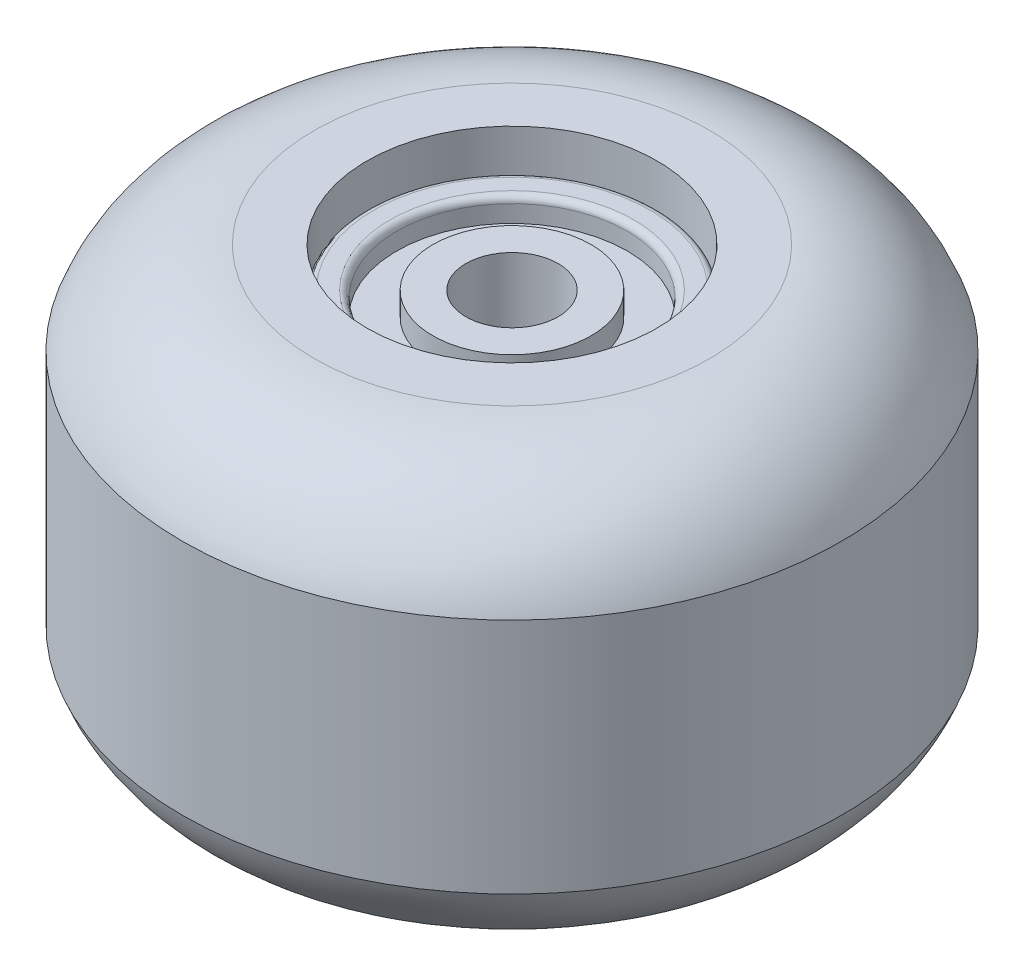
ISO-10303-21;
HEADER;
FILE_DESCRIPTION(('STEP AP214'),'2;1');
FILE_NAME('part.step','',(''),(''),'','','');
FILE_SCHEMA(('AUTOMOTIVE_DESIGN { 1 0 10303 214 1 1 1 1 }'));
ENDSEC;
DATA;
#1=APPLICATION_CONTEXT('core data for automotive mechanical design processes');
#2=APPLICATION_PROTOCOL_DEFINITION('international standard','automotive_design',2000,#1);
#3=PRODUCT_CONTEXT('',#1,'mechanical');
#4=PRODUCT('Part','Part','',(#3));
#5=PRODUCT_RELATED_PRODUCT_CATEGORY('part','',(#4));
#6=PRODUCT_DEFINITION_FORMATION('','',#4);
#7=PRODUCT_DEFINITION_CONTEXT('part definition',#1,'design');
#8=PRODUCT_DEFINITION('design','',#6,#7);
#9=PRODUCT_DEFINITION_SHAPE('','',#8);
#10=(LENGTH_UNIT() NAMED_UNIT(*) SI_UNIT(.MILLI.,.METRE.));
#11=(NAMED_UNIT(*) PLANE_ANGLE_UNIT() SI_UNIT($,.RADIAN.));
#12=(NAMED_UNIT(*) SI_UNIT($,.STERADIAN.) SOLID_ANGLE_UNIT());
#13=UNCERTAINTY_MEASURE_WITH_UNIT(LENGTH_MEASURE(1.E-05),#10,'distance_accuracy_value','');
#14=(GEOMETRIC_REPRESENTATION_CONTEXT(3) GLOBAL_UNCERTAINTY_ASSIGNED_CONTEXT((#13)) GLOBAL_UNIT_ASSIGNED_CONTEXT((#10,
#11,#12)) REPRESENTATION_CONTEXT('',''));
#15=CARTESIAN_POINT('',(0.,0.,0.));
#16=DIRECTION('',(0.,0.,1.));
#17=DIRECTION('',(1.,0.,0.));
#18=AXIS2_PLACEMENT_3D('',#15,#16,#17);
#19=CARTESIAN_POINT('',(0.,6.,0.));
#20=DIRECTION('',(0.,1.,0.));
#21=DIRECTION('',(0.297911004987922,0.,0.954593648159827));
#22=AXIS2_PLACEMENT_3D('',#19,#20,#21);
#23=PLANE('',#22);
#24=CARTESIAN_POINT('',(0.,6.,0.));
#25=DIRECTION('',(0.,1.,0.));
#26=DIRECTION('',(0.297911004987922,0.,0.954593648159827));
#27=AXIS2_PLACEMENT_3D('',#24,#25,#26);
#28=CIRCLE('',#27,3.5);
#29=CARTESIAN_POINT('',(1.04268851745776,6.,3.34107776855938));
#30=VERTEX_POINT('',#29);
#31=EDGE_CURVE('P0_E46',#30,#30,#28,.T.);
#32=ORIENTED_EDGE('',*,*,#31,.T.);
#33=EDGE_LOOP('',(#32));
#34=FACE_BOUND('',#33,.T.);
#35=CARTESIAN_POINT('',(0.,6.,0.));
#36=DIRECTION('',(0.,1.,0.));
#37=DIRECTION('',(0.297911004987922,0.,0.954593648159827));
#38=AXIS2_PLACEMENT_3D('',#35,#36,#37);
#39=CIRCLE('',#38,6.);
#40=CARTESIAN_POINT('',(1.78746602992756,6.,5.72756188895895));
#41=VERTEX_POINT('',#40);
#42=EDGE_CURVE('P0_E65',#41,#41,#39,.T.);
#43=ORIENTED_EDGE('',*,*,#42,.F.);
#44=EDGE_LOOP('',(#43));
#45=FACE_BOUND('',#44,.T.);
#46=ADVANCED_FACE('P0_F14',(#34,#45),#23,.F.);
#47=CARTESIAN_POINT('',(0.,13.,0.));
#48=DIRECTION('',(0.,1.,0.));
#49=DIRECTION('',(0.297911004987922,0.,0.954593648159827));
#50=AXIS2_PLACEMENT_3D('',#47,#48,#49);
#51=PLANE('',#50);
#52=CARTESIAN_POINT('',(0.,13.,0.));
#53=DIRECTION('',(0.,1.,0.));
#54=DIRECTION('',(0.297911004987922,0.,0.954593648159827));
#55=AXIS2_PLACEMENT_3D('',#52,#53,#54);
#56=CIRCLE('',#55,3.5);
#57=CARTESIAN_POINT('',(1.04268851745776,13.,3.34107776855938));
#58=VERTEX_POINT('',#57);
#59=EDGE_CURVE('P0_E47',#58,#58,#56,.T.);
#60=ORIENTED_EDGE('',*,*,#59,.F.);
#61=EDGE_LOOP('',(#60));
#62=FACE_BOUND('',#61,.T.);
#63=CARTESIAN_POINT('',(0.,13.,0.));
#64=DIRECTION('',(0.,1.,0.));
#65=DIRECTION('',(0.297911004987922,0.,0.954593648159827));
#66=AXIS2_PLACEMENT_3D('',#63,#64,#65);
#67=CIRCLE('',#66,6.);
#68=CARTESIAN_POINT('',(1.78746602992756,13.,5.72756188895895));
#69=VERTEX_POINT('',#68);
#70=EDGE_CURVE('P0_E56',#69,#69,#67,.T.);
#71=ORIENTED_EDGE('',*,*,#70,.T.);
#72=EDGE_LOOP('',(#71));
#73=FACE_BOUND('',#72,.T.);
#74=ADVANCED_FACE('P0_F82',(#62,#73),#51,.T.);
#75=CARTESIAN_POINT('',(0.,13.,0.));
#76=DIRECTION('',(0.,-1.,0.));
#77=DIRECTION('',(-0.297911004987922,0.,-0.954593648159827));
#78=AXIS2_PLACEMENT_3D('',#75,#76,#77);
#79=CYLINDRICAL_SURFACE('',#78,11.);
#80=CARTESIAN_POINT('',(0.,12.5,0.));
#81=DIRECTION('',(0.,1.,0.));
#82=DIRECTION('',(0.297911004987922,0.,0.954593648159827));
#83=AXIS2_PLACEMENT_3D('',#80,#81,#82);
#84=CIRCLE('',#83,11.);
#85=CARTESIAN_POINT('',(3.27702105486717,12.5,10.5005301297581));
#86=VERTEX_POINT('',#85);
#87=EDGE_CURVE('P0_E34',#86,#86,#84,.F.);
#88=ORIENTED_EDGE('',*,*,#87,.T.);
#89=EDGE_LOOP('',(#88));
#90=FACE_BOUND('',#89,.T.);
#91=CARTESIAN_POINT('',(0.,6.5,0.));
#92=DIRECTION('',(0.,1.,0.));
#93=DIRECTION('',(0.297911004987922,0.,0.954593648159827));
#94=AXIS2_PLACEMENT_3D('',#91,#92,#93);
#95=CIRCLE('',#94,11.);
#96=CARTESIAN_POINT('',(3.27702105486717,6.5,10.5005301297581));
#97=VERTEX_POINT('',#96);
#98=EDGE_CURVE('P0_E37',#97,#97,#95,.T.);
#99=ORIENTED_EDGE('',*,*,#98,.T.);
#100=EDGE_LOOP('',(#99));
#101=FACE_BOUND('',#100,.T.);
#102=ADVANCED_FACE('P0_F90',(#90,#101),#79,.T.);
#103=CARTESIAN_POINT('',(0.,13.,0.));
#104=DIRECTION('',(0.,1.,0.));
#105=DIRECTION('',(0.297911004987922,0.,0.954593648159827));
#106=AXIS2_PLACEMENT_3D('',#103,#104,#105);
#107=CIRCLE('',#106,10.5);
#108=CARTESIAN_POINT('',(3.12806555237321,13.,10.0232333056782));
#109=VERTEX_POINT('',#108);
#110=EDGE_CURVE('P0_E40',#109,#109,#107,.T.);
#111=ORIENTED_EDGE('',*,*,#110,.T.);
#112=EDGE_LOOP('',(#111));
#113=FACE_BOUND('',#112,.T.);
#114=CARTESIAN_POINT('',(0.,13.,0.));
#115=DIRECTION('',(0.,1.,0.));
#116=DIRECTION('',(0.297911004987922,0.,0.954593648159827));
#117=AXIS2_PLACEMENT_3D('',#114,#115,#116);
#118=CIRCLE('',#117,9.25);
#119=CARTESIAN_POINT('',(2.75567679613831,13.,8.82999124547839));
#120=VERTEX_POINT('',#119);
#121=EDGE_CURVE('P0_E43',#120,#120,#118,.F.);
#122=ORIENTED_EDGE('',*,*,#121,.T.);
#123=EDGE_LOOP('',(#122));
#124=FACE_BOUND('',#123,.T.);
#125=ADVANCED_FACE('P0_F93',(#113,#124),#51,.T.);
#126=CARTESIAN_POINT('',(0.,6.,0.));
#127=DIRECTION('',(0.,1.,0.));
#128=DIRECTION('',(0.297911004987922,0.,0.954593648159827));
#129=AXIS2_PLACEMENT_3D('',#126,#127,#128);
#130=CIRCLE('',#129,10.5);
#131=CARTESIAN_POINT('',(3.12806555237321,6.,10.0232333056782));
#132=VERTEX_POINT('',#131);
#133=EDGE_CURVE('P0_E21',#132,#132,#130,.F.);
#134=ORIENTED_EDGE('',*,*,#133,.T.);
#135=EDGE_LOOP('',(#134));
#136=FACE_BOUND('',#135,.T.);
#137=CARTESIAN_POINT('',(0.,6.,0.));
#138=DIRECTION('',(0.,1.,0.));
#139=DIRECTION('',(0.297911004987922,0.,0.954593648159827));
#140=AXIS2_PLACEMENT_3D('',#137,#138,#139);
#141=CIRCLE('',#140,9.25);
#142=CARTESIAN_POINT('',(2.75567679613831,6.,8.82999124547839));
#143=VERTEX_POINT('',#142);
#144=EDGE_CURVE('P0_E25',#143,#143,#141,.T.);
#145=ORIENTED_EDGE('',*,*,#144,.T.);
#146=EDGE_LOOP('',(#145));
#147=FACE_BOUND('',#146,.T.);
#148=ADVANCED_FACE('P0_F85',(#136,#147),#23,.F.);
#149=CARTESIAN_POINT('',(0.,6.,0.));
#150=DIRECTION('',(0.,1.,0.));
#151=DIRECTION('',(0.297911004987922,0.,0.954593648159827));
#152=AXIS2_PLACEMENT_3D('',#149,#150,#151);
#153=CYLINDRICAL_SURFACE('',#152,3.5);
#154=ORIENTED_EDGE('',*,*,#31,.F.);
#155=EDGE_LOOP('',(#154));
#156=FACE_BOUND('',#155,.T.);
#157=ORIENTED_EDGE('',*,*,#59,.T.);
#158=EDGE_LOOP('',(#157));
#159=FACE_BOUND('',#158,.T.);
#160=ADVANCED_FACE('P0_F96',(#156,#159),#153,.F.);
#161=CARTESIAN_POINT('',(0.,11.2,0.));
#162=DIRECTION('',(0.,1.,0.));
#163=DIRECTION('',(0.297911004987922,0.,0.954593648159827));
#164=AXIS2_PLACEMENT_3D('',#161,#162,#163);
#165=CYLINDRICAL_SURFACE('',#164,8.75);
#166=CARTESIAN_POINT('',(0.,12.5,0.));
#167=DIRECTION('',(0.,1.,0.));
#168=DIRECTION('',(0.297911004987922,0.,0.954593648159827));
#169=AXIS2_PLACEMENT_3D('',#166,#167,#168);
#170=CIRCLE('',#169,8.75);
#171=CARTESIAN_POINT('',(2.60672129364435,12.5,8.35269442139847));
#172=VERTEX_POINT('',#171);
#173=EDGE_CURVE('P0_E29',#172,#172,#170,.T.);
#174=ORIENTED_EDGE('',*,*,#173,.T.);
#175=EDGE_LOOP('',(#174));
#176=FACE_BOUND('',#175,.T.);
#177=CARTESIAN_POINT('',(0.,11.2,0.));
#178=DIRECTION('',(0.,1.,0.));
#179=DIRECTION('',(0.297911004987922,0.,0.954593648159827));
#180=AXIS2_PLACEMENT_3D('',#177,#178,#179);
#181=CIRCLE('',#180,8.75);
#182=CARTESIAN_POINT('',(2.60672129364435,11.2,8.35269442139847));
#183=VERTEX_POINT('',#182);
#184=EDGE_CURVE('P0_E50',#183,#183,#181,.T.);
#185=ORIENTED_EDGE('',*,*,#184,.F.);
#186=EDGE_LOOP('',(#185));
#187=FACE_BOUND('',#186,.T.);
#188=ADVANCED_FACE('P0_F101',(#176,#187),#165,.F.);
#189=CARTESIAN_POINT('',(0.,11.2,0.));
#190=DIRECTION('',(0.,1.,0.));
#191=DIRECTION('',(0.297911004987922,0.,0.954593648159827));
#192=AXIS2_PLACEMENT_3D('',#189,#190,#191);
#193=PLANE('',#192);
#194=CARTESIAN_POINT('',(0.,11.2,0.));
#195=DIRECTION('',(0.,1.,0.));
#196=DIRECTION('',(0.297911004987922,0.,0.954593648159827));
#197=AXIS2_PLACEMENT_3D('',#194,#195,#196);
#198=CIRCLE('',#197,6.);
#199=CARTESIAN_POINT('',(1.78746602992756,11.2,5.72756188895895));
#200=VERTEX_POINT('',#199);
#201=EDGE_CURVE('P0_E55',#200,#200,#198,.T.);
#202=ORIENTED_EDGE('',*,*,#201,.F.);
#203=EDGE_LOOP('',(#202));
#204=FACE_BOUND('',#203,.T.);
#205=ORIENTED_EDGE('',*,*,#184,.T.);
#206=EDGE_LOOP('',(#205));
#207=FACE_BOUND('',#206,.T.);
#208=ADVANCED_FACE('P0_F141',(#204,#207),#193,.T.);
#209=CARTESIAN_POINT('',(0.,11.2,0.));
#210=DIRECTION('',(0.,1.,0.));
#211=DIRECTION('',(0.297911004987922,0.,0.954593648159827));
#212=AXIS2_PLACEMENT_3D('',#209,#210,#211);
#213=CYLINDRICAL_SURFACE('',#212,6.);
#214=ORIENTED_EDGE('',*,*,#201,.T.);
#215=EDGE_LOOP('',(#214));
#216=FACE_BOUND('',#215,.T.);
#217=ORIENTED_EDGE('',*,*,#70,.F.);
#218=EDGE_LOOP('',(#217));
#219=FACE_BOUND('',#218,.T.);
#220=ADVANCED_FACE('P0_F146',(#216,#219),#213,.T.);
#221=CARTESIAN_POINT('',(0.,7.8,0.));
#222=DIRECTION('',(0.,-1.,0.));
#223=DIRECTION('',(0.297911004987922,0.,0.954593648159827));
#224=AXIS2_PLACEMENT_3D('',#221,#222,#223);
#225=PLANE('',#224);
#226=CARTESIAN_POINT('',(0.,7.8,0.));
#227=DIRECTION('',(0.,1.,0.));
#228=DIRECTION('',(0.297911004987922,0.,0.954593648159827));
#229=AXIS2_PLACEMENT_3D('',#226,#227,#228);
#230=CIRCLE('',#229,8.75);
#231=CARTESIAN_POINT('',(2.60672129364435,7.8,8.35269442139847));
#232=VERTEX_POINT('',#231);
#233=EDGE_CURVE('P0_E59',#232,#232,#230,.T.);
#234=ORIENTED_EDGE('',*,*,#233,.F.);
#235=EDGE_LOOP('',(#234));
#236=FACE_BOUND('',#235,.T.);
#237=CARTESIAN_POINT('',(0.,7.8,0.));
#238=DIRECTION('',(0.,1.,0.));
#239=DIRECTION('',(0.297911004987922,0.,0.954593648159827));
#240=AXIS2_PLACEMENT_3D('',#237,#238,#239);
#241=CIRCLE('',#240,6.);
#242=CARTESIAN_POINT('',(1.78746602992756,7.8,5.72756188895895));
#243=VERTEX_POINT('',#242);
#244=EDGE_CURVE('P0_E64',#243,#243,#241,.T.);
#245=ORIENTED_EDGE('',*,*,#244,.T.);
#246=EDGE_LOOP('',(#245));
#247=FACE_BOUND('',#246,.T.);
#248=ADVANCED_FACE('P0_F71',(#236,#247),#225,.T.);
#249=CARTESIAN_POINT('',(0.,7.8,0.));
#250=DIRECTION('',(0.,-1.,0.));
#251=DIRECTION('',(-0.297911004987922,0.,-0.954593648159827));
#252=AXIS2_PLACEMENT_3D('',#249,#250,#251);
#253=CYLINDRICAL_SURFACE('',#252,8.75);
#254=CARTESIAN_POINT('',(0.,6.5,0.));
#255=DIRECTION('',(0.,1.,0.));
#256=DIRECTION('',(0.297911004987922,0.,0.954593648159827));
#257=AXIS2_PLACEMENT_3D('',#254,#255,#256);
#258=CIRCLE('',#257,8.75);
#259=CARTESIAN_POINT('',(2.60672129364435,6.5,8.35269442139847));
#260=VERTEX_POINT('',#259);
#261=EDGE_CURVE('P0_E10',#260,#260,#258,.F.);
#262=ORIENTED_EDGE('',*,*,#261,.T.);
#263=EDGE_LOOP('',(#262));
#264=FACE_BOUND('',#263,.T.);
#265=ORIENTED_EDGE('',*,*,#233,.T.);
#266=EDGE_LOOP('',(#265));
#267=FACE_BOUND('',#266,.T.);
#268=ADVANCED_FACE('P0_F77',(#264,#267),#253,.F.);
#269=CARTESIAN_POINT('',(0.,7.8,0.));
#270=DIRECTION('',(0.,-1.,0.));
#271=DIRECTION('',(-0.297911004987922,0.,-0.954593648159827));
#272=AXIS2_PLACEMENT_3D('',#269,#270,#271);
#273=CYLINDRICAL_SURFACE('',#272,6.);
#274=ORIENTED_EDGE('',*,*,#244,.F.);
#275=EDGE_LOOP('',(#274));
#276=FACE_BOUND('',#275,.T.);
#277=ORIENTED_EDGE('',*,*,#42,.T.);
#278=EDGE_LOOP('',(#277));
#279=FACE_BOUND('',#278,.T.);
#280=ADVANCED_FACE('P0_F73',(#276,#279),#273,.T.);
#281=CARTESIAN_POINT('',(0.,12.5,0.));
#282=DIRECTION('',(0.,1.,0.));
#283=DIRECTION('',(0.297911004987922,0.,0.954593648159827));
#284=AXIS2_PLACEMENT_3D('',#281,#282,#283);
#285=TOROIDAL_SURFACE('',#284,10.5,0.5);
#286=ORIENTED_EDGE('',*,*,#87,.F.);
#287=EDGE_LOOP('',(#286));
#288=FACE_BOUND('',#287,.T.);
#289=ORIENTED_EDGE('',*,*,#110,.F.);
#290=EDGE_LOOP('',(#289));
#291=FACE_BOUND('',#290,.T.);
#292=ADVANCED_FACE('P0_F76',(#288,#291),#285,.T.);
#293=CARTESIAN_POINT('',(0.,12.5,0.));
#294=DIRECTION('',(0.,1.,0.));
#295=DIRECTION('',(0.297911004987922,0.,0.954593648159827));
#296=AXIS2_PLACEMENT_3D('',#293,#294,#295);
#297=TOROIDAL_SURFACE('',#296,9.25,0.5);
#298=ORIENTED_EDGE('',*,*,#121,.F.);
#299=EDGE_LOOP('',(#298));
#300=FACE_BOUND('',#299,.T.);
#301=ORIENTED_EDGE('',*,*,#173,.F.);
#302=EDGE_LOOP('',(#301));
#303=FACE_BOUND('',#302,.T.);
#304=ADVANCED_FACE('P0_F114',(#300,#303),#297,.T.);
#305=CARTESIAN_POINT('',(0.,6.5,0.));
#306=DIRECTION('',(0.,1.,0.));
#307=DIRECTION('',(0.297911004987922,0.,0.954593648159827));
#308=AXIS2_PLACEMENT_3D('',#305,#306,#307);
#309=TOROIDAL_SURFACE('',#308,10.5,0.5);
#310=ORIENTED_EDGE('',*,*,#133,.F.);
#311=EDGE_LOOP('',(#310));
#312=FACE_BOUND('',#311,.T.);
#313=ORIENTED_EDGE('',*,*,#98,.F.);
#314=EDGE_LOOP('',(#313));
#315=FACE_BOUND('',#314,.T.);
#316=ADVANCED_FACE('P0_F109',(#312,#315),#309,.T.);
#317=CARTESIAN_POINT('',(0.,6.5,0.));
#318=DIRECTION('',(0.,1.,0.));
#319=DIRECTION('',(0.297911004987922,0.,0.954593648159827));
#320=AXIS2_PLACEMENT_3D('',#317,#318,#319);
#321=TOROIDAL_SURFACE('',#320,9.25,0.5);
#322=ORIENTED_EDGE('',*,*,#261,.F.);
#323=EDGE_LOOP('',(#322));
#324=FACE_BOUND('',#323,.T.);
#325=ORIENTED_EDGE('',*,*,#144,.F.);
#326=EDGE_LOOP('',(#325));
#327=FACE_BOUND('',#326,.T.);
#328=ADVANCED_FACE('P0_F16',(#324,#327),#321,.T.);
#329=CLOSED_SHELL('',(#46,#74,#102,#125,#148,#160,#188,#208,#220,#248,#268,#280,#292,#304,#316,#328));
#330=MANIFOLD_SOLID_BREP('P0_B1',#329);
#331=CARTESIAN_POINT('',(0.,-13.,0.));
#332=DIRECTION('',(0.,1.,0.));
#333=DIRECTION('',(0.016209118928033,0.,0.99986862360191));
#334=AXIS2_PLACEMENT_3D('',#331,#332,#333);
#335=PLANE('',#334);
#336=CARTESIAN_POINT('',(0.,-13.,0.));
#337=DIRECTION('',(0.,1.,0.));
#338=DIRECTION('',(0.016209118928033,0.,0.99986862360191));
#339=AXIS2_PLACEMENT_3D('',#336,#337,#338);
#340=CIRCLE('',#339,3.5);
#341=CARTESIAN_POINT('',(0.0567319162481223,-13.,3.49954018260668));
#342=VERTEX_POINT('',#341);
#343=EDGE_CURVE('P1_E46',#342,#342,#340,.T.);
#344=ORIENTED_EDGE('',*,*,#343,.T.);
#345=EDGE_LOOP('',(#344));
#346=FACE_BOUND('',#345,.T.);
#347=CARTESIAN_POINT('',(0.,-13.,0.));
#348=DIRECTION('',(0.,1.,0.));
#349=DIRECTION('',(0.016209118928033,0.,0.99986862360191));
#350=AXIS2_PLACEMENT_3D('',#347,#348,#349);
#351=CIRCLE('',#350,6.);
#352=CARTESIAN_POINT('',(0.0972547135682047,-13.,5.99921174161146));
#353=VERTEX_POINT('',#352);
#354=EDGE_CURVE('P1_E65',#353,#353,#351,.T.);
#355=ORIENTED_EDGE('',*,*,#354,.F.);
#356=EDGE_LOOP('',(#355));
#357=FACE_BOUND('',#356,.T.);
#358=ADVANCED_FACE('P1_F14',(#346,#357),#335,.F.);
#359=CARTESIAN_POINT('',(0.,-6.,0.));
#360=DIRECTION('',(0.,1.,0.));
#361=DIRECTION('',(0.016209118928033,0.,0.99986862360191));
#362=AXIS2_PLACEMENT_3D('',#359,#360,#361);
#363=PLANE('',#362);
#364=CARTESIAN_POINT('',(0.,-6.,0.));
#365=DIRECTION('',(0.,1.,0.));
#366=DIRECTION('',(0.016209118928033,0.,0.99986862360191));
#367=AXIS2_PLACEMENT_3D('',#364,#365,#366);
#368=CIRCLE('',#367,3.5);
#369=CARTESIAN_POINT('',(0.0567319162481223,-6.,3.49954018260668));
#370=VERTEX_POINT('',#369);
#371=EDGE_CURVE('P1_E47',#370,#370,#368,.T.);
#372=ORIENTED_EDGE('',*,*,#371,.F.);
#373=EDGE_LOOP('',(#372));
#374=FACE_BOUND('',#373,.T.);
#375=CARTESIAN_POINT('',(0.,-6.,0.));
#376=DIRECTION('',(0.,1.,0.));
#377=DIRECTION('',(0.016209118928033,0.,0.99986862360191));
#378=AXIS2_PLACEMENT_3D('',#375,#376,#377);
#379=CIRCLE('',#378,6.);
#380=CARTESIAN_POINT('',(0.0972547135682047,-6.,5.99921174161146));
#381=VERTEX_POINT('',#380);
#382=EDGE_CURVE('P1_E56',#381,#381,#379,.T.);
#383=ORIENTED_EDGE('',*,*,#382,.T.);
#384=EDGE_LOOP('',(#383));
#385=FACE_BOUND('',#384,.T.);
#386=ADVANCED_FACE('P1_F82',(#374,#385),#363,.T.);
#387=CARTESIAN_POINT('',(0.,-6.,0.));
#388=DIRECTION('',(0.,-1.,0.));
#389=DIRECTION('',(-0.016209118928033,0.,-0.99986862360191));
#390=AXIS2_PLACEMENT_3D('',#387,#388,#389);
#391=CYLINDRICAL_SURFACE('',#390,11.);
#392=CARTESIAN_POINT('',(0.,-6.5,0.));
#393=DIRECTION('',(0.,1.,0.));
#394=DIRECTION('',(0.016209118928033,0.,0.99986862360191));
#395=AXIS2_PLACEMENT_3D('',#392,#393,#394);
#396=CIRCLE('',#395,11.);
#397=CARTESIAN_POINT('',(0.178300308208369,-6.5,10.998554859621));
#398=VERTEX_POINT('',#397);
#399=EDGE_CURVE('P1_E34',#398,#398,#396,.F.);
#400=ORIENTED_EDGE('',*,*,#399,.T.);
#401=EDGE_LOOP('',(#400));
#402=FACE_BOUND('',#401,.T.);
#403=CARTESIAN_POINT('',(0.,-12.5,0.));
#404=DIRECTION('',(0.,1.,0.));
#405=DIRECTION('',(0.016209118928033,0.,0.99986862360191));
#406=AXIS2_PLACEMENT_3D('',#403,#404,#405);
#407=CIRCLE('',#406,11.);
#408=CARTESIAN_POINT('',(0.178300308208369,-12.5,10.998554859621));
#409=VERTEX_POINT('',#408);
#410=EDGE_CURVE('P1_E37',#409,#409,#407,.T.);
#411=ORIENTED_EDGE('',*,*,#410,.T.);
#412=EDGE_LOOP('',(#411));
#413=FACE_BOUND('',#412,.T.);
#414=ADVANCED_FACE('P1_F90',(#402,#413),#391,.T.);
#415=CARTESIAN_POINT('',(0.,-6.,0.));
#416=DIRECTION('',(0.,1.,0.));
#417=DIRECTION('',(0.016209118928033,0.,0.99986862360191));
#418=AXIS2_PLACEMENT_3D('',#415,#416,#417);
#419=CIRCLE('',#418,10.5);
#420=CARTESIAN_POINT('',(0.170195748744353,-6.,10.49862054782));
#421=VERTEX_POINT('',#420);
#422=EDGE_CURVE('P1_E40',#421,#421,#419,.T.);
#423=ORIENTED_EDGE('',*,*,#422,.T.);
#424=EDGE_LOOP('',(#423));
#425=FACE_BOUND('',#424,.T.);
#426=CARTESIAN_POINT('',(0.,-6.,0.));
#427=DIRECTION('',(0.,1.,0.));
#428=DIRECTION('',(0.016209118928033,0.,0.99986862360191));
#429=AXIS2_PLACEMENT_3D('',#426,#427,#428);
#430=CIRCLE('',#429,9.25);
#431=CARTESIAN_POINT('',(0.149934350084312,-6.,9.24878476831767));
#432=VERTEX_POINT('',#431);
#433=EDGE_CURVE('P1_E43',#432,#432,#430,.F.);
#434=ORIENTED_EDGE('',*,*,#433,.T.);
#435=EDGE_LOOP('',(#434));
#436=FACE_BOUND('',#435,.T.);
#437=ADVANCED_FACE('P1_F93',(#425,#436),#363,.T.);
#438=CARTESIAN_POINT('',(0.,-13.,0.));
#439=DIRECTION('',(0.,1.,0.));
#440=DIRECTION('',(0.016209118928033,0.,0.99986862360191));
#441=AXIS2_PLACEMENT_3D('',#438,#439,#440);
#442=CIRCLE('',#441,10.5);
#443=CARTESIAN_POINT('',(0.170195748744353,-13.,10.49862054782));
#444=VERTEX_POINT('',#443);
#445=EDGE_CURVE('P1_E21',#444,#444,#442,.F.);
#446=ORIENTED_EDGE('',*,*,#445,.T.);
#447=EDGE_LOOP('',(#446));
#448=FACE_BOUND('',#447,.T.);
#449=CARTESIAN_POINT('',(0.,-13.,0.));
#450=DIRECTION('',(0.,1.,0.));
#451=DIRECTION('',(0.016209118928033,0.,0.99986862360191));
#452=AXIS2_PLACEMENT_3D('',#449,#450,#451);
#453=CIRCLE('',#452,9.25);
#454=CARTESIAN_POINT('',(0.149934350084312,-13.,9.24878476831767));
#455=VERTEX_POINT('',#454);
#456=EDGE_CURVE('P1_E25',#455,#455,#453,.T.);
#457=ORIENTED_EDGE('',*,*,#456,.T.);
#458=EDGE_LOOP('',(#457));
#459=FACE_BOUND('',#458,.T.);
#460=ADVANCED_FACE('P1_F85',(#448,#459),#335,.F.);
#461=CARTESIAN_POINT('',(0.,-13.,0.));
#462=DIRECTION('',(0.,1.,0.));
#463=DIRECTION('',(0.016209118928033,0.,0.99986862360191));
#464=AXIS2_PLACEMENT_3D('',#461,#462,#463);
#465=CYLINDRICAL_SURFACE('',#464,3.5);
#466=ORIENTED_EDGE('',*,*,#343,.F.);
#467=EDGE_LOOP('',(#466));
#468=FACE_BOUND('',#467,.T.);
#469=ORIENTED_EDGE('',*,*,#371,.T.);
#470=EDGE_LOOP('',(#469));
#471=FACE_BOUND('',#470,.T.);
#472=ADVANCED_FACE('P1_F96',(#468,#471),#465,.F.);
#473=CARTESIAN_POINT('',(0.,-7.8,0.));
#474=DIRECTION('',(0.,1.,0.));
#475=DIRECTION('',(0.016209118928033,0.,0.99986862360191));
#476=AXIS2_PLACEMENT_3D('',#473,#474,#475);
#477=CYLINDRICAL_SURFACE('',#476,8.75);
#478=CARTESIAN_POINT('',(0.,-6.5,0.));
#479=DIRECTION('',(0.,1.,0.));
#480=DIRECTION('',(0.016209118928033,0.,0.99986862360191));
#481=AXIS2_PLACEMENT_3D('',#478,#479,#480);
#482=CIRCLE('',#481,8.75);
#483=CARTESIAN_POINT('',(0.141829790620295,-6.5,8.74885045651671));
#484=VERTEX_POINT('',#483);
#485=EDGE_CURVE('P1_E29',#484,#484,#482,.T.);
#486=ORIENTED_EDGE('',*,*,#485,.T.);
#487=EDGE_LOOP('',(#486));
#488=FACE_BOUND('',#487,.T.);
#489=CARTESIAN_POINT('',(0.,-7.8,0.));
#490=DIRECTION('',(0.,1.,0.));
#491=DIRECTION('',(0.016209118928033,0.,0.99986862360191));
#492=AXIS2_PLACEMENT_3D('',#489,#490,#491);
#493=CIRCLE('',#492,8.75);
#494=CARTESIAN_POINT('',(0.141829790620295,-7.8,8.74885045651671));
#495=VERTEX_POINT('',#494);
#496=EDGE_CURVE('P1_E50',#495,#495,#493,.T.);
#497=ORIENTED_EDGE('',*,*,#496,.F.);
#498=EDGE_LOOP('',(#497));
#499=FACE_BOUND('',#498,.T.);
#500=ADVANCED_FACE('P1_F101',(#488,#499),#477,.F.);
#501=CARTESIAN_POINT('',(0.,-7.8,0.));
#502=DIRECTION('',(0.,1.,0.));
#503=DIRECTION('',(0.016209118928033,0.,0.99986862360191));
#504=AXIS2_PLACEMENT_3D('',#501,#502,#503);
#505=PLANE('',#504);
#506=CARTESIAN_POINT('',(0.,-7.8,0.));
#507=DIRECTION('',(0.,1.,0.));
#508=DIRECTION('',(0.016209118928033,0.,0.99986862360191));
#509=AXIS2_PLACEMENT_3D('',#506,#507,#508);
#510=CIRCLE('',#509,6.);
#511=CARTESIAN_POINT('',(0.0972547135682047,-7.8,5.99921174161146));
#512=VERTEX_POINT('',#511);
#513=EDGE_CURVE('P1_E55',#512,#512,#510,.T.);
#514=ORIENTED_EDGE('',*,*,#513,.F.);
#515=EDGE_LOOP('',(#514));
#516=FACE_BOUND('',#515,.T.);
#517=ORIENTED_EDGE('',*,*,#496,.T.);
#518=EDGE_LOOP('',(#517));
#519=FACE_BOUND('',#518,.T.);
#520=ADVANCED_FACE('P1_F141',(#516,#519),#505,.T.);
#521=CARTESIAN_POINT('',(0.,-7.8,0.));
#522=DIRECTION('',(0.,1.,0.));
#523=DIRECTION('',(0.016209118928033,0.,0.99986862360191));
#524=AXIS2_PLACEMENT_3D('',#521,#522,#523);
#525=CYLINDRICAL_SURFACE('',#524,6.);
#526=ORIENTED_EDGE('',*,*,#513,.T.);
#527=EDGE_LOOP('',(#526));
#528=FACE_BOUND('',#527,.T.);
#529=ORIENTED_EDGE('',*,*,#382,.F.);
#530=EDGE_LOOP('',(#529));
#531=FACE_BOUND('',#530,.T.);
#532=ADVANCED_FACE('P1_F146',(#528,#531),#525,.T.);
#533=CARTESIAN_POINT('',(0.,-11.2,0.));
#534=DIRECTION('',(0.,-1.,0.));
#535=DIRECTION('',(0.016209118928033,0.,0.99986862360191));
#536=AXIS2_PLACEMENT_3D('',#533,#534,#535);
#537=PLANE('',#536);
#538=CARTESIAN_POINT('',(0.,-11.2,0.));
#539=DIRECTION('',(0.,1.,0.));
#540=DIRECTION('',(0.016209118928033,0.,0.99986862360191));
#541=AXIS2_PLACEMENT_3D('',#538,#539,#540);
#542=CIRCLE('',#541,8.75);
#543=CARTESIAN_POINT('',(0.141829790620295,-11.2,8.74885045651671));
#544=VERTEX_POINT('',#543);
#545=EDGE_CURVE('P1_E59',#544,#544,#542,.T.);
#546=ORIENTED_EDGE('',*,*,#545,.F.);
#547=EDGE_LOOP('',(#546));
#548=FACE_BOUND('',#547,.T.);
#549=CARTESIAN_POINT('',(0.,-11.2,0.));
#550=DIRECTION('',(0.,1.,0.));
#551=DIRECTION('',(0.016209118928033,0.,0.99986862360191));
#552=AXIS2_PLACEMENT_3D('',#549,#550,#551);
#553=CIRCLE('',#552,6.);
#554=CARTESIAN_POINT('',(0.0972547135682047,-11.2,5.99921174161146));
#555=VERTEX_POINT('',#554);
#556=EDGE_CURVE('P1_E64',#555,#555,#553,.T.);
#557=ORIENTED_EDGE('',*,*,#556,.T.);
#558=EDGE_LOOP('',(#557));
#559=FACE_BOUND('',#558,.T.);
#560=ADVANCED_FACE('P1_F71',(#548,#559),#537,.T.);
#561=CARTESIAN_POINT('',(0.,-11.2,0.));
#562=DIRECTION('',(0.,-1.,0.));
#563=DIRECTION('',(-0.016209118928033,0.,-0.99986862360191));
#564=AXIS2_PLACEMENT_3D('',#561,#562,#563);
#565=CYLINDRICAL_SURFACE('',#564,8.75);
#566=CARTESIAN_POINT('',(0.,-12.5,0.));
#567=DIRECTION('',(0.,1.,0.));
#568=DIRECTION('',(0.016209118928033,0.,0.99986862360191));
#569=AXIS2_PLACEMENT_3D('',#566,#567,#568);
#570=CIRCLE('',#569,8.75);
#571=CARTESIAN_POINT('',(0.141829790620295,-12.5,8.74885045651671));
#572=VERTEX_POINT('',#571);
#573=EDGE_CURVE('P1_E10',#572,#572,#570,.F.);
#574=ORIENTED_EDGE('',*,*,#573,.T.);
#575=EDGE_LOOP('',(#574));
#576=FACE_BOUND('',#575,.T.);
#577=ORIENTED_EDGE('',*,*,#545,.T.);
#578=EDGE_LOOP('',(#577));
#579=FACE_BOUND('',#578,.T.);
#580=ADVANCED_FACE('P1_F77',(#576,#579),#565,.F.);
#581=CARTESIAN_POINT('',(0.,-11.2,0.));
#582=DIRECTION('',(0.,-1.,0.));
#583=DIRECTION('',(-0.016209118928033,0.,-0.99986862360191));
#584=AXIS2_PLACEMENT_3D('',#581,#582,#583);
#585=CYLINDRICAL_SURFACE('',#584,6.);
#586=ORIENTED_EDGE('',*,*,#556,.F.);
#587=EDGE_LOOP('',(#586));
#588=FACE_BOUND('',#587,.T.);
#589=ORIENTED_EDGE('',*,*,#354,.T.);
#590=EDGE_LOOP('',(#589));
#591=FACE_BOUND('',#590,.T.);
#592=ADVANCED_FACE('P1_F73',(#588,#591),#585,.T.);
#593=CARTESIAN_POINT('',(0.,-6.5,0.));
#594=DIRECTION('',(0.,1.,0.));
#595=DIRECTION('',(0.016209118928033,0.,0.99986862360191));
#596=AXIS2_PLACEMENT_3D('',#593,#594,#595);
#597=TOROIDAL_SURFACE('',#596,10.5,0.5);
#598=ORIENTED_EDGE('',*,*,#399,.F.);
#599=EDGE_LOOP('',(#598));
#600=FACE_BOUND('',#599,.T.);
#601=ORIENTED_EDGE('',*,*,#422,.F.);
#602=EDGE_LOOP('',(#601));
#603=FACE_BOUND('',#602,.T.);
#604=ADVANCED_FACE('P1_F76',(#600,#603),#597,.T.);
#605=CARTESIAN_POINT('',(0.,-6.5,0.));
#606=DIRECTION('',(0.,1.,0.));
#607=DIRECTION('',(0.016209118928033,0.,0.99986862360191));
#608=AXIS2_PLACEMENT_3D('',#605,#606,#607);
#609=TOROIDAL_SURFACE('',#608,9.25,0.5);
#610=ORIENTED_EDGE('',*,*,#433,.F.);
#611=EDGE_LOOP('',(#610));
#612=FACE_BOUND('',#611,.T.);
#613=ORIENTED_EDGE('',*,*,#485,.F.);
#614=EDGE_LOOP('',(#613));
#615=FACE_BOUND('',#614,.T.);
#616=ADVANCED_FACE('P1_F114',(#612,#615),#609,.T.);
#617=CARTESIAN_POINT('',(0.,-12.5,0.));
#618=DIRECTION('',(0.,1.,0.));
#619=DIRECTION('',(0.016209118928033,0.,0.99986862360191));
#620=AXIS2_PLACEMENT_3D('',#617,#618,#619);
#621=TOROIDAL_SURFACE('',#620,10.5,0.5);
#622=ORIENTED_EDGE('',*,*,#445,.F.);
#623=EDGE_LOOP('',(#622));
#624=FACE_BOUND('',#623,.T.);
#625=ORIENTED_EDGE('',*,*,#410,.F.);
#626=EDGE_LOOP('',(#625));
#627=FACE_BOUND('',#626,.T.);
#628=ADVANCED_FACE('P1_F109',(#624,#627),#621,.T.);
#629=CARTESIAN_POINT('',(0.,-12.5,0.));
#630=DIRECTION('',(0.,1.,0.));
#631=DIRECTION('',(0.016209118928033,0.,0.99986862360191));
#632=AXIS2_PLACEMENT_3D('',#629,#630,#631);
#633=TOROIDAL_SURFACE('',#632,9.25,0.5);
#634=ORIENTED_EDGE('',*,*,#573,.F.);
#635=EDGE_LOOP('',(#634));
#636=FACE_BOUND('',#635,.T.);
#637=ORIENTED_EDGE('',*,*,#456,.F.);
#638=EDGE_LOOP('',(#637));
#639=FACE_BOUND('',#638,.T.);
#640=ADVANCED_FACE('P1_F16',(#636,#639),#633,.T.);
#641=CLOSED_SHELL('',(#358,#386,#414,#437,#460,#472,#500,#520,#532,#560,#580,#592,#604,#616,
#628,#640));
#642=MANIFOLD_SOLID_BREP('P1_B1',#641);
#643=CARTESIAN_POINT('',(11.,-16.,0.));
#644=DIRECTION('',(0.,1.,0.));
#645=DIRECTION('',(0.,0.,1.));
#646=AXIS2_PLACEMENT_3D('',#643,#644,#645);
#647=PLANE('',#646);
#648=CARTESIAN_POINT('',(0.,-16.,0.));
#649=DIRECTION('',(0.,1.,0.));
#650=DIRECTION('',(0.,0.,1.));
#651=AXIS2_PLACEMENT_3D('',#648,#649,#650);
#652=CIRCLE('',#651,15.);
#653=CARTESIAN_POINT('',(0.,-16.,15.));
#654=VERTEX_POINT('',#653);
#655=EDGE_CURVE('P2_E10',#654,#654,#652,.T.);
#656=ORIENTED_EDGE('',*,*,#655,.F.);
#657=EDGE_LOOP('',(#656));
#658=FACE_BOUND('',#657,.T.);
#659=CARTESIAN_POINT('',(0.,-16.,0.));
#660=DIRECTION('',(0.,1.,0.));
#661=DIRECTION('',(0.,0.,1.));
#662=AXIS2_PLACEMENT_3D('',#659,#660,#661);
#663=CIRCLE('',#662,11.);
#664=CARTESIAN_POINT('',(0.,-16.,11.));
#665=VERTEX_POINT('',#664);
#666=EDGE_CURVE('P2_E36',#665,#665,#663,.T.);
#667=ORIENTED_EDGE('',*,*,#666,.T.);
#668=EDGE_LOOP('',(#667));
#669=FACE_BOUND('',#668,.T.);
#670=ADVANCED_FACE('P2_F14',(#658,#669),#647,.F.);
#671=CARTESIAN_POINT('',(0.,-5.35714285714286,0.));
#672=DIRECTION('',(0.,1.,0.));
#673=DIRECTION('',(0.,0.,1.));
#674=AXIS2_PLACEMENT_3D('',#671,#672,#673);
#675=TOROIDAL_SURFACE('',#674,15.,10.6428571428571);
#676=CARTESIAN_POINT('',(0.,-9.,0.));
#677=DIRECTION('',(0.,1.,0.));
#678=DIRECTION('',(0.,0.,1.));
#679=AXIS2_PLACEMENT_3D('',#676,#677,#678);
#680=CIRCLE('',#679,25.);
#681=CARTESIAN_POINT('',(0.,-9.,25.));
#682=VERTEX_POINT('',#681);
#683=EDGE_CURVE('P2_E20',#682,#682,#680,.T.);
#684=ORIENTED_EDGE('',*,*,#683,.F.);
#685=EDGE_LOOP('',(#684));
#686=FACE_BOUND('',#685,.T.);
#687=ORIENTED_EDGE('',*,*,#655,.T.);
#688=EDGE_LOOP('',(#687));
#689=FACE_BOUND('',#688,.T.);
#690=ADVANCED_FACE('P2_F61',(#686,#689),#675,.T.);
#691=CARTESIAN_POINT('',(0.,16.6738549090547,0.));
#692=DIRECTION('',(0.,1.,0.));
#693=DIRECTION('',(0.,0.,1.));
#694=AXIS2_PLACEMENT_3D('',#691,#692,#693);
#695=CYLINDRICAL_SURFACE('',#694,25.);
#696=CARTESIAN_POINT('',(0.,9.,0.));
#697=DIRECTION('',(0.,1.,0.));
#698=DIRECTION('',(0.,0.,1.));
#699=AXIS2_PLACEMENT_3D('',#696,#697,#698);
#700=CIRCLE('',#699,25.);
#701=CARTESIAN_POINT('',(0.,9.,25.));
#702=VERTEX_POINT('',#701);
#703=EDGE_CURVE('P2_E24',#702,#702,#700,.T.);
#704=ORIENTED_EDGE('',*,*,#703,.F.);
#705=EDGE_LOOP('',(#704));
#706=FACE_BOUND('',#705,.T.);
#707=ORIENTED_EDGE('',*,*,#683,.T.);
#708=EDGE_LOOP('',(#707));
#709=FACE_BOUND('',#708,.T.);
#710=ADVANCED_FACE('P2_F56',(#706,#709),#695,.T.);
#711=CARTESIAN_POINT('',(0.,5.35714285714286,0.));
#712=DIRECTION('',(0.,1.,0.));
#713=DIRECTION('',(0.,0.,1.));
#714=AXIS2_PLACEMENT_3D('',#711,#712,#713);
#715=TOROIDAL_SURFACE('',#714,15.,10.6428571428571);
#716=CARTESIAN_POINT('',(0.,16.,0.));
#717=DIRECTION('',(0.,1.,0.));
#718=DIRECTION('',(0.,0.,1.));
#719=AXIS2_PLACEMENT_3D('',#716,#717,#718);
#720=CIRCLE('',#719,15.);
#721=CARTESIAN_POINT('',(0.,16.,15.));
#722=VERTEX_POINT('',#721);
#723=EDGE_CURVE('P2_E28',#722,#722,#720,.T.);
#724=ORIENTED_EDGE('',*,*,#723,.F.);
#725=EDGE_LOOP('',(#724));
#726=FACE_BOUND('',#725,.T.);
#727=ORIENTED_EDGE('',*,*,#703,.T.);
#728=EDGE_LOOP('',(#727));
#729=FACE_BOUND('',#728,.T.);
#730=ADVANCED_FACE('P2_F50',(#726,#729),#715,.T.);
#731=CARTESIAN_POINT('',(11.,16.,0.));
#732=DIRECTION('',(0.,-1.,0.));
#733=DIRECTION('',(0.,0.,-1.));
#734=AXIS2_PLACEMENT_3D('',#731,#732,#733);
#735=PLANE('',#734);
#736=CARTESIAN_POINT('',(0.,16.,0.));
#737=DIRECTION('',(0.,1.,0.));
#738=DIRECTION('',(0.,0.,1.));
#739=AXIS2_PLACEMENT_3D('',#736,#737,#738);
#740=CIRCLE('',#739,11.);
#741=CARTESIAN_POINT('',(0.,16.,11.));
#742=VERTEX_POINT('',#741);
#743=EDGE_CURVE('P2_E33',#742,#742,#740,.T.);
#744=ORIENTED_EDGE('',*,*,#743,.F.);
#745=EDGE_LOOP('',(#744));
#746=FACE_BOUND('',#745,.T.);
#747=ORIENTED_EDGE('',*,*,#723,.T.);
#748=EDGE_LOOP('',(#747));
#749=FACE_BOUND('',#748,.T.);
#750=ADVANCED_FACE('P2_F44',(#746,#749),#735,.F.);
#751=CARTESIAN_POINT('',(0.,16.6738549090547,0.));
#752=DIRECTION('',(0.,1.,0.));
#753=DIRECTION('',(0.,0.,1.));
#754=AXIS2_PLACEMENT_3D('',#751,#752,#753);
#755=CYLINDRICAL_SURFACE('',#754,11.);
#756=ORIENTED_EDGE('',*,*,#666,.F.);
#757=EDGE_LOOP('',(#756));
#758=FACE_BOUND('',#757,.T.);
#759=ORIENTED_EDGE('',*,*,#743,.T.);
#760=EDGE_LOOP('',(#759));
#761=FACE_BOUND('',#760,.T.);
#762=ADVANCED_FACE('P2_F41',(#758,#761),#755,.F.);
#763=CLOSED_SHELL('',(#670,#690,#710,#730,#750,#762));
#764=MANIFOLD_SOLID_BREP('P2_B1',#763);
#765=ADVANCED_BREP_SHAPE_REPRESENTATION('',(#18,#330,#642,#764),#14);
#766=SHAPE_DEFINITION_REPRESENTATION(#9,#765);
ENDSEC;
END-ISO-10303-21;
